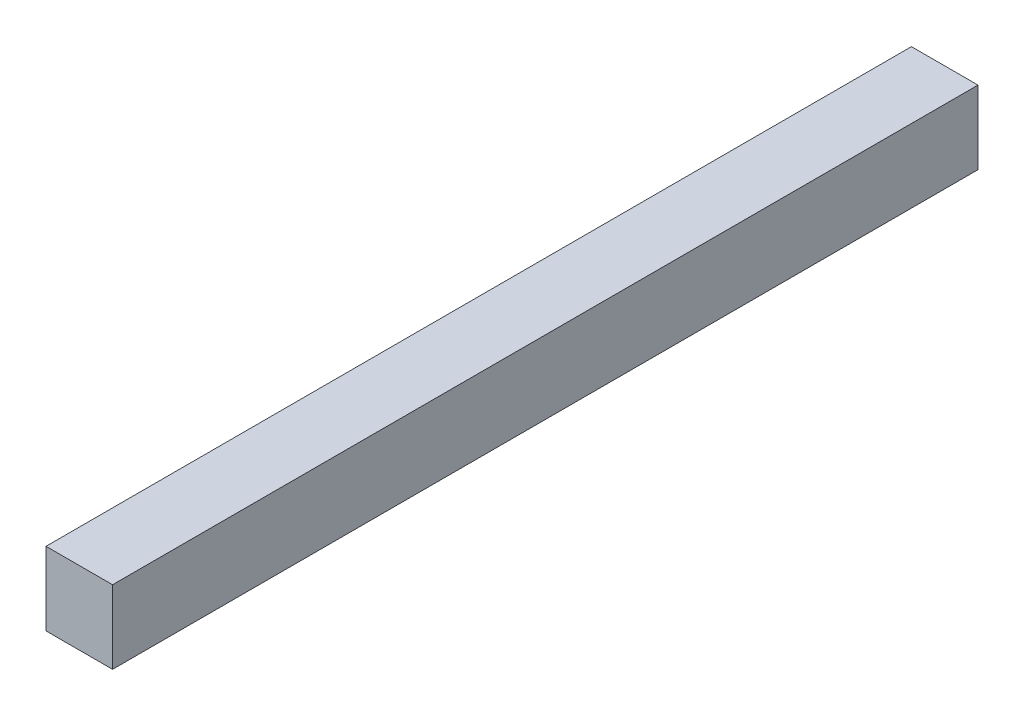
ISO-10303-21;
HEADER;
FILE_DESCRIPTION(('STEP AP214'),'2;1');
FILE_NAME('part.step','',(''),(''),'','','');
FILE_SCHEMA(('AUTOMOTIVE_DESIGN { 1 0 10303 214 1 1 1 1 }'));
ENDSEC;
DATA;
#1=APPLICATION_CONTEXT('core data for automotive mechanical design processes');
#2=APPLICATION_PROTOCOL_DEFINITION('international standard','automotive_design',2000,#1);
#3=PRODUCT_CONTEXT('',#1,'mechanical');
#4=PRODUCT('Part','Part','',(#3));
#5=PRODUCT_RELATED_PRODUCT_CATEGORY('part','',(#4));
#6=PRODUCT_DEFINITION_FORMATION('','',#4);
#7=PRODUCT_DEFINITION_CONTEXT('part definition',#1,'design');
#8=PRODUCT_DEFINITION('design','',#6,#7);
#9=PRODUCT_DEFINITION_SHAPE('','',#8);
#10=(LENGTH_UNIT() NAMED_UNIT(*) SI_UNIT(.MILLI.,.METRE.));
#11=(NAMED_UNIT(*) PLANE_ANGLE_UNIT() SI_UNIT($,.RADIAN.));
#12=(NAMED_UNIT(*) SI_UNIT($,.STERADIAN.) SOLID_ANGLE_UNIT());
#13=UNCERTAINTY_MEASURE_WITH_UNIT(LENGTH_MEASURE(1.E-05),#10,'distance_accuracy_value','');
#14=(GEOMETRIC_REPRESENTATION_CONTEXT(3) GLOBAL_UNCERTAINTY_ASSIGNED_CONTEXT((#13)) GLOBAL_UNIT_ASSIGNED_CONTEXT((#10,
#11,#12)) REPRESENTATION_CONTEXT('',''));
#15=CARTESIAN_POINT('',(0.,0.,0.));
#16=DIRECTION('',(0.,0.,1.));
#17=DIRECTION('',(1.,0.,0.));
#18=AXIS2_PLACEMENT_3D('',#15,#16,#17);
#19=CARTESIAN_POINT('',(-10.,11.01,260.));
#20=DIRECTION('',(0.,1.,0.));
#21=DIRECTION('',(0.,0.,1.));
#22=AXIS2_PLACEMENT_3D('',#19,#20,#21);
#23=PLANE('',#22);
#24=DIRECTION('',(1.,0.,0.));
#25=VECTOR('',#24,1.);
#26=CARTESIAN_POINT('',(-10.,11.01,0.));
#27=LINE('',#26,#25);
#28=CARTESIAN_POINT('',(-10.,11.01,0.));
#29=VERTEX_POINT('',#28);
#30=CARTESIAN_POINT('',(10.,11.01,0.));
#31=VERTEX_POINT('',#30);
#32=EDGE_CURVE('E111',#29,#31,#27,.T.);
#33=ORIENTED_EDGE('',*,*,#32,.F.);
#34=DIRECTION('',(0.,0.,-1.));
#35=VECTOR('',#34,1.);
#36=CARTESIAN_POINT('',(-10.,11.01,260.));
#37=LINE('',#36,#35);
#38=CARTESIAN_POINT('',(-10.,11.01,260.));
#39=VERTEX_POINT('',#38);
#40=EDGE_CURVE('E11',#39,#29,#37,.T.);
#41=ORIENTED_EDGE('',*,*,#40,.F.);
#42=DIRECTION('',(1.,0.,0.));
#43=VECTOR('',#42,1.);
#44=CARTESIAN_POINT('',(-10.,11.01,260.));
#45=LINE('',#44,#43);
#46=CARTESIAN_POINT('',(10.,11.01,260.));
#47=VERTEX_POINT('',#46);
#48=EDGE_CURVE('E103',#39,#47,#45,.T.);
#49=ORIENTED_EDGE('',*,*,#48,.T.);
#50=DIRECTION('',(0.,0.,-1.));
#51=VECTOR('',#50,1.);
#52=CARTESIAN_POINT('',(10.,11.01,260.));
#53=LINE('',#52,#51);
#54=EDGE_CURVE('E42',#47,#31,#53,.T.);
#55=ORIENTED_EDGE('',*,*,#54,.T.);
#56=EDGE_LOOP('',(#33,#41,#49,#55));
#57=FACE_BOUND('',#56,.T.);
#58=ADVANCED_FACE('F41',(#57),#23,.T.);
#59=CARTESIAN_POINT('',(-10.,11.01,260.));
#60=DIRECTION('',(1.,0.,0.));
#61=DIRECTION('',(0.,0.,-1.));
#62=AXIS2_PLACEMENT_3D('',#59,#60,#61);
#63=PLANE('',#62);
#64=DIRECTION('',(0.,-1.,0.));
#65=VECTOR('',#64,1.);
#66=CARTESIAN_POINT('',(-10.,11.01,0.));
#67=LINE('',#66,#65);
#68=CARTESIAN_POINT('',(-10.,-11.01,0.));
#69=VERTEX_POINT('',#68);
#70=EDGE_CURVE('E75',#29,#69,#67,.T.);
#71=ORIENTED_EDGE('',*,*,#70,.T.);
#72=DIRECTION('',(0.,0.,-1.));
#73=VECTOR('',#72,1.);
#74=CARTESIAN_POINT('',(-10.,-11.01,260.));
#75=LINE('',#74,#73);
#76=CARTESIAN_POINT('',(-10.,-11.01,260.));
#77=VERTEX_POINT('',#76);
#78=EDGE_CURVE('E51',#77,#69,#75,.T.);
#79=ORIENTED_EDGE('',*,*,#78,.F.);
#80=DIRECTION('',(0.,-1.,0.));
#81=VECTOR('',#80,1.);
#82=CARTESIAN_POINT('',(-10.,11.01,260.));
#83=LINE('',#82,#81);
#84=EDGE_CURVE('E95',#39,#77,#83,.T.);
#85=ORIENTED_EDGE('',*,*,#84,.F.);
#86=ORIENTED_EDGE('',*,*,#40,.T.);
#87=EDGE_LOOP('',(#71,#79,#85,#86));
#88=FACE_BOUND('',#87,.T.);
#89=ADVANCED_FACE('F132',(#88),#63,.F.);
#90=CARTESIAN_POINT('',(-10.,-11.01,260.));
#91=DIRECTION('',(0.,1.,0.));
#92=DIRECTION('',(0.,0.,1.));
#93=AXIS2_PLACEMENT_3D('',#90,#91,#92);
#94=PLANE('',#93);
#95=DIRECTION('',(1.,0.,0.));
#96=VECTOR('',#95,1.);
#97=CARTESIAN_POINT('',(-10.,-11.01,0.));
#98=LINE('',#97,#96);
#99=CARTESIAN_POINT('',(10.,-11.01,0.));
#100=VERTEX_POINT('',#99);
#101=EDGE_CURVE('E99',#69,#100,#98,.T.);
#102=ORIENTED_EDGE('',*,*,#101,.T.);
#103=DIRECTION('',(0.,0.,-1.));
#104=VECTOR('',#103,1.);
#105=CARTESIAN_POINT('',(10.,-11.01,260.));
#106=LINE('',#105,#104);
#107=CARTESIAN_POINT('',(10.,-11.01,260.));
#108=VERTEX_POINT('',#107);
#109=EDGE_CURVE('E100',#108,#100,#106,.T.);
#110=ORIENTED_EDGE('',*,*,#109,.F.);
#111=DIRECTION('',(1.,0.,0.));
#112=VECTOR('',#111,1.);
#113=CARTESIAN_POINT('',(-10.,-11.01,260.));
#114=LINE('',#113,#112);
#115=EDGE_CURVE('E90',#77,#108,#114,.T.);
#116=ORIENTED_EDGE('',*,*,#115,.F.);
#117=ORIENTED_EDGE('',*,*,#78,.T.);
#118=EDGE_LOOP('',(#102,#110,#116,#117));
#119=FACE_BOUND('',#118,.T.);
#120=ADVANCED_FACE('F97',(#119),#94,.F.);
#121=CARTESIAN_POINT('',(10.,11.01,260.));
#122=DIRECTION('',(1.,0.,0.));
#123=DIRECTION('',(0.,0.,-1.));
#124=AXIS2_PLACEMENT_3D('',#121,#122,#123);
#125=PLANE('',#124);
#126=DIRECTION('',(0.,-1.,0.));
#127=VECTOR('',#126,1.);
#128=CARTESIAN_POINT('',(10.,11.01,0.));
#129=LINE('',#128,#127);
#130=EDGE_CURVE('E117',#31,#100,#129,.T.);
#131=ORIENTED_EDGE('',*,*,#130,.F.);
#132=ORIENTED_EDGE('',*,*,#54,.F.);
#133=DIRECTION('',(0.,-1.,0.));
#134=VECTOR('',#133,1.);
#135=CARTESIAN_POINT('',(10.,11.01,260.));
#136=LINE('',#135,#134);
#137=EDGE_CURVE('E91',#47,#108,#136,.T.);
#138=ORIENTED_EDGE('',*,*,#137,.T.);
#139=ORIENTED_EDGE('',*,*,#109,.T.);
#140=EDGE_LOOP('',(#131,#132,#138,#139));
#141=FACE_BOUND('',#140,.T.);
#142=ADVANCED_FACE('F104',(#141),#125,.T.);
#143=CARTESIAN_POINT('',(0.,0.,260.));
#144=DIRECTION('',(0.,0.,-1.));
#145=DIRECTION('',(-1.,0.,0.));
#146=AXIS2_PLACEMENT_3D('',#143,#144,#145);
#147=PLANE('',#146);
#148=ORIENTED_EDGE('',*,*,#48,.F.);
#149=ORIENTED_EDGE('',*,*,#84,.T.);
#150=ORIENTED_EDGE('',*,*,#115,.T.);
#151=ORIENTED_EDGE('',*,*,#137,.F.);
#152=EDGE_LOOP('',(#148,#149,#150,#151));
#153=FACE_BOUND('',#152,.T.);
#154=ADVANCED_FACE('F89',(#153),#147,.F.);
#155=CARTESIAN_POINT('',(0.,0.,0.));
#156=DIRECTION('',(0.,0.,-1.));
#157=DIRECTION('',(-1.,0.,0.));
#158=AXIS2_PLACEMENT_3D('',#155,#156,#157);
#159=PLANE('',#158);
#160=ORIENTED_EDGE('',*,*,#32,.T.);
#161=ORIENTED_EDGE('',*,*,#130,.T.);
#162=ORIENTED_EDGE('',*,*,#101,.F.);
#163=ORIENTED_EDGE('',*,*,#70,.F.);
#164=EDGE_LOOP('',(#160,#161,#162,#163));
#165=FACE_BOUND('',#164,.T.);
#166=ADVANCED_FACE('F130',(#165),#159,.T.);
#167=CLOSED_SHELL('',(#58,#89,#120,#142,#154,#166));
#168=MANIFOLD_SOLID_BREP('B2',#167);
#169=ADVANCED_BREP_SHAPE_REPRESENTATION('',(#18,#168),#14);
#170=SHAPE_DEFINITION_REPRESENTATION(#9,#169);
ENDSEC;
END-ISO-10303-21;
